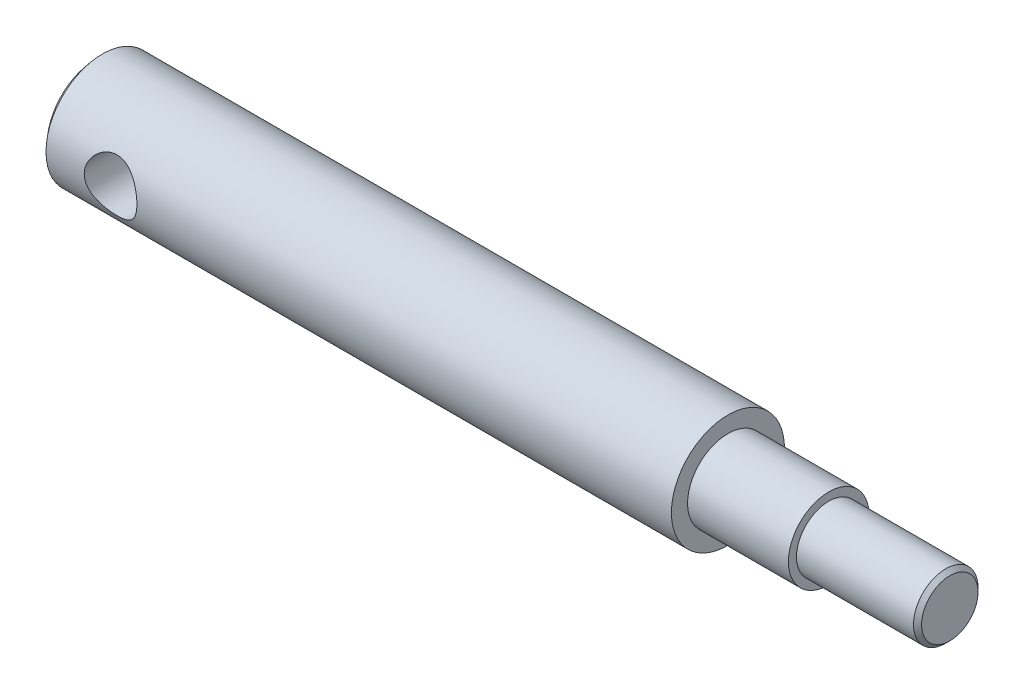
ISO-10303-21;
HEADER;
FILE_DESCRIPTION(('STEP AP214'),'2;1');
FILE_NAME('part.step','',(''),(''),'','','');
FILE_SCHEMA(('AUTOMOTIVE_DESIGN { 1 0 10303 214 1 1 1 1 }'));
ENDSEC;
DATA;
#1=APPLICATION_CONTEXT('core data for automotive mechanical design processes');
#2=APPLICATION_PROTOCOL_DEFINITION('international standard','automotive_design',2000,#1);
#3=PRODUCT_CONTEXT('',#1,'mechanical');
#4=PRODUCT('Part','Part','',(#3));
#5=PRODUCT_RELATED_PRODUCT_CATEGORY('part','',(#4));
#6=PRODUCT_DEFINITION_FORMATION('','',#4);
#7=PRODUCT_DEFINITION_CONTEXT('part definition',#1,'design');
#8=PRODUCT_DEFINITION('design','',#6,#7);
#9=PRODUCT_DEFINITION_SHAPE('','',#8);
#10=(LENGTH_UNIT() NAMED_UNIT(*) SI_UNIT(.MILLI.,.METRE.));
#11=(NAMED_UNIT(*) PLANE_ANGLE_UNIT() SI_UNIT($,.RADIAN.));
#12=(NAMED_UNIT(*) SI_UNIT($,.STERADIAN.) SOLID_ANGLE_UNIT());
#13=UNCERTAINTY_MEASURE_WITH_UNIT(LENGTH_MEASURE(1.E-05),#10,'distance_accuracy_value','');
#14=(GEOMETRIC_REPRESENTATION_CONTEXT(3) GLOBAL_UNCERTAINTY_ASSIGNED_CONTEXT((#13)) GLOBAL_UNIT_ASSIGNED_CONTEXT((#10,
#11,#12)) REPRESENTATION_CONTEXT('',''));
#15=CARTESIAN_POINT('',(0.,0.,0.));
#16=DIRECTION('',(0.,0.,1.));
#17=DIRECTION('',(1.,0.,0.));
#18=AXIS2_PLACEMENT_3D('',#15,#16,#17);
#19=CARTESIAN_POINT('',(21.9709396637103,0.,-1.13040271301872));
#20=DIRECTION('',(0.,-1.,0.));
#21=DIRECTION('',(0.,0.,1.));
#22=AXIS2_PLACEMENT_3D('',#19,#20,#21);
#23=CIRCLE('',#22,22.);
#24=TRIMMED_CURVE('',#23,(PARAMETER_VALUE(-1.51939174944715)),
(PARAMETER_VALUE(1.51939174944715)),.T.,.PARAMETER.);
#25=CARTESIAN_POINT('',(21.9709396637103,0.,0.));
#26=DIRECTION('',(-1.,0.,0.));
#27=AXIS1_PLACEMENT('',#25,#26);
#28=SURFACE_OF_REVOLUTION('',#24,#27);
#29=CARTESIAN_POINT('',(0.,0.,0.));
#30=VERTEX_POINT('',#29);
#31=VERTEX_LOOP('',#30);
#32=FACE_BOUND('',#31,.T.);
#33=CARTESIAN_POINT('',(6.,0.,0.));
#34=DIRECTION('',(-1.,0.,0.));
#35=DIRECTION('',(0.,0.,1.));
#36=AXIS2_PLACEMENT_3D('',#33,#34,#35);
#37=CIRCLE('',#36,14.);
#38=CARTESIAN_POINT('',(6.,0.,14.));
#39=VERTEX_POINT('',#38);
#40=EDGE_CURVE('E65',#39,#39,#37,.T.);
#41=ORIENTED_EDGE('',*,*,#40,.T.);
#42=EDGE_LOOP('',(#41));
#43=FACE_BOUND('',#42,.T.);
#44=ADVANCED_FACE('F43',(#32,#43),#28,.T.);
#45=CARTESIAN_POINT('',(216.,0.,0.));
#46=DIRECTION('',(-1.,0.,0.));
#47=DIRECTION('',(0.,0.,1.));
#48=AXIS2_PLACEMENT_3D('',#45,#46,#47);
#49=PLANE('',#48);
#50=CARTESIAN_POINT('',(216.,0.,0.));
#51=DIRECTION('',(-1.,0.,0.));
#52=DIRECTION('',(0.,0.,1.));
#53=AXIS2_PLACEMENT_3D('',#50,#51,#52);
#54=CIRCLE('',#53,6.99999999999996);
#55=CARTESIAN_POINT('',(216.,0.,6.99999999999996));
#56=VERTEX_POINT('',#55);
#57=EDGE_CURVE('E11',#56,#56,#54,.T.);
#58=ORIENTED_EDGE('',*,*,#57,.F.);
#59=EDGE_LOOP('',(#58));
#60=FACE_BOUND('',#59,.T.);
#61=ADVANCED_FACE('F62',(#60),#49,.F.);
#62=CARTESIAN_POINT('',(216.,0.,0.));
#63=DIRECTION('',(-1.,0.,0.));
#64=DIRECTION('',(0.,0.,1.));
#65=AXIS2_PLACEMENT_3D('',#62,#63,#64);
#66=CONICAL_SURFACE('',#65,6.99999999999996,0.785398163397448);
#67=CARTESIAN_POINT('',(215.,0.,0.));
#68=DIRECTION('',(-1.,0.,0.));
#69=DIRECTION('',(0.,0.,1.));
#70=AXIS2_PLACEMENT_3D('',#67,#68,#69);
#71=CIRCLE('',#70,7.99999999999996);
#72=CARTESIAN_POINT('',(215.,0.,7.99999999999996));
#73=VERTEX_POINT('',#72);
#74=EDGE_CURVE('E56',#73,#73,#71,.T.);
#75=ORIENTED_EDGE('',*,*,#74,.F.);
#76=EDGE_LOOP('',(#75));
#77=FACE_BOUND('',#76,.T.);
#78=ORIENTED_EDGE('',*,*,#57,.T.);
#79=EDGE_LOOP('',(#78));
#80=FACE_BOUND('',#79,.T.);
#81=ADVANCED_FACE('F135',(#77,#80),#66,.T.);
#82=CARTESIAN_POINT('',(0.,0.,0.));
#83=DIRECTION('',(-1.,0.,0.));
#84=DIRECTION('',(0.,0.,1.));
#85=AXIS2_PLACEMENT_3D('',#82,#83,#84);
#86=CYLINDRICAL_SURFACE('',#85,7.99999999999996);
#87=CARTESIAN_POINT('',(186.,0.,0.));
#88=DIRECTION('',(-1.,0.,0.));
#89=DIRECTION('',(0.,0.,1.));
#90=AXIS2_PLACEMENT_3D('',#87,#88,#89);
#91=CIRCLE('',#90,7.99999999999997);
#92=CARTESIAN_POINT('',(186.,0.,7.99999999999997));
#93=VERTEX_POINT('',#92);
#94=EDGE_CURVE('E85',#93,#93,#91,.T.);
#95=ORIENTED_EDGE('',*,*,#94,.F.);
#96=EDGE_LOOP('',(#95));
#97=FACE_BOUND('',#96,.T.);
#98=ORIENTED_EDGE('',*,*,#74,.T.);
#99=EDGE_LOOP('',(#98));
#100=FACE_BOUND('',#99,.T.);
#101=ADVANCED_FACE('F129',(#97,#100),#86,.T.);
#102=CARTESIAN_POINT('',(186.,7.99999999999997,0.));
#103=DIRECTION('',(-1.,0.,0.));
#104=DIRECTION('',(0.,0.,1.));
#105=AXIS2_PLACEMENT_3D('',#102,#103,#104);
#106=PLANE('',#105);
#107=CARTESIAN_POINT('',(186.,0.,0.));
#108=DIRECTION('',(-1.,0.,0.));
#109=DIRECTION('',(0.,0.,1.));
#110=AXIS2_PLACEMENT_3D('',#107,#108,#109);
#111=CIRCLE('',#110,10.);
#112=CARTESIAN_POINT('',(186.,0.,10.));
#113=VERTEX_POINT('',#112);
#114=EDGE_CURVE('E81',#113,#113,#111,.T.);
#115=ORIENTED_EDGE('',*,*,#114,.F.);
#116=EDGE_LOOP('',(#115));
#117=FACE_BOUND('',#116,.T.);
#118=ORIENTED_EDGE('',*,*,#94,.T.);
#119=EDGE_LOOP('',(#118));
#120=FACE_BOUND('',#119,.T.);
#121=ADVANCED_FACE('F123',(#117,#120),#106,.F.);
#122=CARTESIAN_POINT('',(0.,0.,0.));
#123=DIRECTION('',(-1.,0.,0.));
#124=DIRECTION('',(0.,0.,1.));
#125=AXIS2_PLACEMENT_3D('',#122,#123,#124);
#126=CYLINDRICAL_SURFACE('',#125,9.99999999999999);
#127=CARTESIAN_POINT('',(161.,0.,0.));
#128=DIRECTION('',(-1.,0.,0.));
#129=DIRECTION('',(0.,0.,1.));
#130=AXIS2_PLACEMENT_3D('',#127,#128,#129);
#131=CIRCLE('',#130,9.99999999999999);
#132=CARTESIAN_POINT('',(161.,0.,9.99999999999999));
#133=VERTEX_POINT('',#132);
#134=EDGE_CURVE('E73',#133,#133,#131,.T.);
#135=ORIENTED_EDGE('',*,*,#134,.F.);
#136=EDGE_LOOP('',(#135));
#137=FACE_BOUND('',#136,.T.);
#138=ORIENTED_EDGE('',*,*,#114,.T.);
#139=EDGE_LOOP('',(#138));
#140=FACE_BOUND('',#139,.T.);
#141=ADVANCED_FACE('F118',(#137,#140),#126,.T.);
#142=CARTESIAN_POINT('',(161.,9.99999999999999,0.));
#143=DIRECTION('',(-1.,0.,0.));
#144=DIRECTION('',(0.,0.,1.));
#145=AXIS2_PLACEMENT_3D('',#142,#143,#144);
#146=PLANE('',#145);
#147=CARTESIAN_POINT('',(161.,0.,0.));
#148=DIRECTION('',(-1.,0.,0.));
#149=DIRECTION('',(0.,0.,1.));
#150=AXIS2_PLACEMENT_3D('',#147,#148,#149);
#151=CIRCLE('',#150,14.);
#152=CARTESIAN_POINT('',(161.,0.,14.));
#153=VERTEX_POINT('',#152);
#154=EDGE_CURVE('E68',#153,#153,#151,.T.);
#155=ORIENTED_EDGE('',*,*,#154,.F.);
#156=EDGE_LOOP('',(#155));
#157=FACE_BOUND('',#156,.T.);
#158=ORIENTED_EDGE('',*,*,#134,.T.);
#159=EDGE_LOOP('',(#158));
#160=FACE_BOUND('',#159,.T.);
#161=ADVANCED_FACE('F107',(#157,#160),#146,.F.);
#162=CARTESIAN_POINT('',(0.,0.,0.));
#163=DIRECTION('',(-1.,0.,0.));
#164=DIRECTION('',(0.,0.,1.));
#165=AXIS2_PLACEMENT_3D('',#162,#163,#164);
#166=CYLINDRICAL_SURFACE('',#165,14.);
#167=CARTESIAN_POINT('',(28.525,0.,14.));
#168=CARTESIAN_POINT('',(28.5249988115517,-0.172961585399824,13.9999989763916));
#169=CARTESIAN_POINT('',(28.5181142009919,-0.345955335434678,13.9967866267679));
#170=CARTESIAN_POINT('',(28.4906472082468,-0.690686654918813,13.9840170322901));
#171=CARTESIAN_POINT('',(28.4700576977243,-0.86242352360486,13.9744564855512));
#172=CARTESIAN_POINT('',(28.4153656284769,-1.20357884662734,13.9492186729422));
#173=CARTESIAN_POINT('',(28.3812399649993,-1.37299282183549,13.9335309493484));
#174=CARTESIAN_POINT('',(28.2998340414739,-1.70805603372384,13.8964373934108));
#175=CARTESIAN_POINT('',(28.2525484040739,-1.8737037014445,13.8750292237546));
#176=CARTESIAN_POINT('',(28.1455325345178,-2.19938966095088,13.8271351485202));
#177=CARTESIAN_POINT('',(28.0858547228063,-2.35944836591319,13.8006706682818));
#178=CARTESIAN_POINT('',(27.9544618529155,-2.67376897138034,13.7432347055915));
#179=CARTESIAN_POINT('',(27.8827422987142,-2.8280286802885,13.7122615403098));
#180=CARTESIAN_POINT('',(27.7279092536524,-3.12976206362347,13.6465529347583));
#181=CARTESIAN_POINT('',(27.6448027589596,-3.27723983115224,13.6118198073492));
#182=CARTESIAN_POINT('',(27.4677595136981,-3.5647963977443,13.5393595459155));
#183=CARTESIAN_POINT('',(27.3738188114603,-3.70487246977678,13.5016313210325));
#184=CARTESIAN_POINT('',(27.0658905241392,-4.12772725323102,13.3809785077786));
#185=CARTESIAN_POINT('',(26.8341505463098,-4.39678369077359,13.2942642643216));
#186=CARTESIAN_POINT('',(26.3303201868583,-4.89380166725161,13.1194636813799));
#187=CARTESIAN_POINT('',(26.0582035223154,-5.12173622241705,13.0313764818575));
#188=CARTESIAN_POINT('',(25.6146104957753,-5.43561918418219,12.9022479894684));
#189=CARTESIAN_POINT('',(25.4554620225076,-5.53817375744852,12.8584428072728));
#190=CARTESIAN_POINT('',(25.1281745789026,-5.72940047695437,12.7743832344047));
#191=CARTESIAN_POINT('',(24.9600393698687,-5.81807837103057,12.7341273766049));
#192=CARTESIAN_POINT('',(24.6157626284436,-5.98077462726117,12.6585303796142));
#193=CARTESIAN_POINT('',(24.4396213238958,-6.05479340627467,12.6231891006767));
#194=CARTESIAN_POINT('',(24.0805936424508,-6.18735332878388,12.558745759908));
#195=CARTESIAN_POINT('',(23.8977110859509,-6.245903089752,12.5296402259874));
#196=CARTESIAN_POINT('',(23.5368302827655,-6.34403492447861,12.4802272326423));
#197=CARTESIAN_POINT('',(23.3591238661684,-6.38448902139486,12.4595212822461));
#198=CARTESIAN_POINT('',(23.0002550028712,-6.45045668760313,12.4254976779733));
#199=CARTESIAN_POINT('',(22.8190926864607,-6.47597081899671,12.4121797461307));
#200=CARTESIAN_POINT('',(22.4549764606993,-6.51168669968098,12.3934799341597));
#201=CARTESIAN_POINT('',(22.2720238246464,-6.52189863375826,12.388092775535));
#202=CARTESIAN_POINT('',(21.9058560399226,-6.52688900167993,12.3854645237546));
#203=CARTESIAN_POINT('',(21.7226409119551,-6.52166859223294,12.3882228200683));
#204=CARTESIAN_POINT('',(21.3760237847957,-6.49718053639865,12.4010807663484));
#205=CARTESIAN_POINT('',(21.2124867145946,-6.47938234327563,12.4104121469332));
#206=CARTESIAN_POINT('',(20.8876268593489,-6.43157933933406,12.4352528359294));
#207=CARTESIAN_POINT('',(20.7263048358651,-6.40157043383265,12.4507642166765));
#208=CARTESIAN_POINT('',(20.4070281826959,-6.32967932482516,12.4874650625722));
#209=CARTESIAN_POINT('',(20.249072938609,-6.28779930796616,12.5086534819766));
#210=CARTESIAN_POINT('',(19.9373822864394,-6.19256031253002,12.5560751969003));
#211=CARTESIAN_POINT('',(19.7836485493526,-6.13919686027294,12.5823104581283));
#212=CARTESIAN_POINT('',(19.4778565907212,-6.02012794604627,12.6397200367822));
#213=CARTESIAN_POINT('',(19.3259148480781,-5.95417070558451,12.6709926166382));
#214=CARTESIAN_POINT('',(19.0280908928989,-5.81125528934606,12.7371704644988));
#215=CARTESIAN_POINT('',(18.8822108893314,-5.73429314784986,12.7720770408097));
#216=CARTESIAN_POINT('',(18.4547119198259,-5.48768922342668,12.8808992105527));
#217=CARTESIAN_POINT('',(18.183079041386,-5.30226913436632,12.9589478321659));
#218=CARTESIAN_POINT('',(17.6435687383132,-4.87122899435166,13.1274558652518));
#219=CARTESIAN_POINT('',(17.3792818546795,-4.62126474054235,13.2183440942223));
#220=CARTESIAN_POINT('',(17.0162561033881,-4.21556240904635,13.3510078610789));
#221=CARTESIAN_POINT('',(16.9007457212029,-4.07509303387124,13.3946469871098));
#222=CARTESIAN_POINT('',(16.6815667853414,-3.78456900183375,13.4796104485132));
#223=CARTESIAN_POINT('',(16.5778937527845,-3.63451800408817,13.5209356563632));
#224=CARTESIAN_POINT('',(16.3796197240387,-3.32005136498874,13.6016379344314));
#225=CARTESIAN_POINT('',(16.2854797901025,-3.15531303915949,13.6408912818627));
#226=CARTESIAN_POINT('',(16.1115764943754,-2.8174750155879,13.7146529983504));
#227=CARTESIAN_POINT('',(16.031807154623,-2.64437883276825,13.7491633390066));
#228=CARTESIAN_POINT('',(15.8874476453614,-2.29101329254453,13.8124386579041));
#229=CARTESIAN_POINT('',(15.8228524449784,-2.11074633580135,13.8412055398706));
#230=CARTESIAN_POINT('',(15.7095682957501,-1.74437589518115,13.8921323873824));
#231=CARTESIAN_POINT('',(15.660877787126,-1.55827298560125,13.9142930007883));
#232=CARTESIAN_POINT('',(15.5830642534276,-1.19594077902035,13.9499225229576));
#233=CARTESIAN_POINT('',(15.5527465542942,-1.02001925822351,13.9639190924338));
#234=CARTESIAN_POINT('',(15.5066117107657,-0.665890433565697,13.9852796172365));
#235=CARTESIAN_POINT('',(15.490793503867,-0.487683298162096,13.992644058556));
#236=CARTESIAN_POINT('',(15.4738554552896,-0.130477882043718,14.0005314804953));
#237=CARTESIAN_POINT('',(15.4727309478196,0.0485201294777032,14.0010566328414));
#238=CARTESIAN_POINT('',(15.4851828551948,0.405888971009847,13.9952558452273));
#239=CARTESIAN_POINT('',(15.4987587737087,0.584259821991445,13.988930136573));
#240=CARTESIAN_POINT('',(15.539070984327,0.927288621582246,13.9702428704933));
#241=CARTESIAN_POINT('',(15.5648862570086,1.09207901115573,13.9583041542548));
#242=CARTESIAN_POINT('',(15.6289395296202,1.41877781854867,13.9288900033359));
#243=CARTESIAN_POINT('',(15.667181512164,1.58068529485822,13.9114127936784));
#244=CARTESIAN_POINT('',(15.7556943002216,1.90047071621246,13.8713436001078));
#245=CARTESIAN_POINT('',(15.8059615391909,2.05834984068173,13.8487531328315));
#246=CARTESIAN_POINT('',(15.9180905730616,2.3692458347878,13.7989664212972));
#247=CARTESIAN_POINT('',(15.9799567995973,2.52226081975797,13.7717684170182));
#248=CARTESIAN_POINT('',(16.1168084470812,2.82708742867824,13.7124906076469));
#249=CARTESIAN_POINT('',(16.1921341771189,2.97872256024072,13.6802879935455));
#250=CARTESIAN_POINT('',(16.3539563562946,3.27511289944075,13.6123766267351));
#251=CARTESIAN_POINT('',(16.4404569004608,3.41986555825092,13.5766665898813));
#252=CARTESIAN_POINT('',(16.7158502844001,3.84270665563548,13.4654497118022));
#253=CARTESIAN_POINT('',(16.9207084430537,4.10954097919032,13.3858231514148));
#254=CARTESIAN_POINT('',(17.3876381841635,4.62975268144804,13.2154043406347));
#255=CARTESIAN_POINT('',(17.6531501049967,4.87990226815509,13.1242450729771));
#256=CARTESIAN_POINT('',(18.2234280171084,5.33344766120907,12.9465716243688));
#257=CARTESIAN_POINT('',(18.5282125059958,5.53682130929724,12.8600596597061));
#258=CARTESIAN_POINT('',(19.0148182921882,5.80519094930559,12.7400866812116));
#259=CARTESIAN_POINT('',(19.1848810653573,5.8895626271787,12.7011926943675));
#260=CARTESIAN_POINT('',(19.5326369236379,6.04349581775784,12.6286733960662));
#261=CARTESIAN_POINT('',(19.7103265477264,6.11306396459724,12.5950457263251));
#262=CARTESIAN_POINT('',(20.072003611947,6.23658222951957,12.5343442158876));
#263=CARTESIAN_POINT('',(20.255986688443,6.29054293321921,12.5072659351743));
#264=CARTESIAN_POINT('',(20.6289039252938,6.38220710441621,12.4607417244458));
#265=CARTESIAN_POINT('',(20.8178374439198,6.41991266812527,12.4412948103426));
#266=CARTESIAN_POINT('',(21.1817975844801,6.47587500323595,12.4122496079689));
#267=CARTESIAN_POINT('',(21.3565449320331,6.49557708687484,12.4019222949215));
#268=CARTESIAN_POINT('',(21.7073353609104,6.52080412662806,12.3886771358058));
#269=CARTESIAN_POINT('',(21.8833783401378,6.52633018807912,12.3857587120496));
#270=CARTESIAN_POINT('',(22.2352546483854,6.5231305752807,12.3874440236919));
#271=CARTESIAN_POINT('',(22.4110880167595,6.51440822838444,12.3920460028917));
#272=CARTESIAN_POINT('',(22.7611277111579,6.48283802946988,12.4085908784933));
#273=CARTESIAN_POINT('',(22.9353340755161,6.45999051111194,12.4205336014943));
#274=CARTESIAN_POINT('',(23.2681439100937,6.40264322892485,12.4501853406126));
#275=CARTESIAN_POINT('',(23.4269593462454,6.36911384671563,12.467410770028));
#276=CARTESIAN_POINT('',(23.7410633757841,6.29051221557066,12.5072537515944));
#277=CARTESIAN_POINT('',(23.8963508388004,6.24543632234308,12.52987300598));
#278=CARTESIAN_POINT('',(24.202452012443,6.14416880409382,12.5798399519487));
#279=CARTESIAN_POINT('',(24.3532662948025,6.08797860673291,12.6071870361731));
#280=CARTESIAN_POINT('',(24.6497026242441,5.96493813634605,12.6658657668393));
#281=CARTESIAN_POINT('',(24.7953227402962,5.89808394829493,12.6971988757946));
#282=CARTESIAN_POINT('',(25.2421227488125,5.67275442544941,12.8003252418963));
#283=CARTESIAN_POINT('',(25.5330682312975,5.49613888531192,12.8778161655023));
#284=CARTESIAN_POINT('',(26.0829370858879,5.10098162511738,13.0393796079082));
#285=CARTESIAN_POINT('',(26.3418454529104,4.88242038046839,13.1234551808546));
#286=CARTESIAN_POINT('',(26.7146680208038,4.51465719729696,13.2528145150157));
#287=CARTESIAN_POINT('',(26.8414509308316,4.3784294323978,13.298550359562));
#288=CARTESIAN_POINT('',(27.0831370874232,4.0953567747769,13.388430498827));
#289=CARTESIAN_POINT('',(27.1980443531618,3.94851550285482,13.4325753286903));
#290=CARTESIAN_POINT('',(27.4153066692637,3.64485529779218,13.518133751299));
#291=CARTESIAN_POINT('',(27.5176497591398,3.48802706991158,13.5595447244783));
#292=CARTESIAN_POINT('',(27.7088063697523,3.16548198919471,13.6384481649685));
#293=CARTESIAN_POINT('',(27.7976261393903,2.99976928988266,13.675942439591));
#294=CARTESIAN_POINT('',(27.9605671899454,2.66127217939511,13.745811885276));
#295=CARTESIAN_POINT('',(28.0347592102392,2.48852693331199,13.7782115315379));
#296=CARTESIAN_POINT('',(28.1681860308318,2.13647333246546,13.837171365666));
#297=CARTESIAN_POINT('',(28.2274281017542,1.95716821673893,13.863734391246));
#298=CARTESIAN_POINT('',(28.3301864336825,1.59372144054665,13.910195521747));
#299=CARTESIAN_POINT('',(28.3737391340218,1.40959206665999,13.9301090624528));
#300=CARTESIAN_POINT('',(28.4447310404681,1.03771715503999,13.9627337045398));
#301=CARTESIAN_POINT('',(28.4721809319526,0.849974100876478,13.9754495818939));
#302=CARTESIAN_POINT('',(28.5025884878905,0.551502206533356,13.9895655974164));
#303=CARTESIAN_POINT('',(28.510988318285,0.441414367152074,13.9934741984445));
#304=CARTESIAN_POINT('',(28.5221945089965,0.220888728589875,13.9986917522194));
#305=CARTESIAN_POINT('',(28.525000758927,0.110450922545613,14.0000006536624));
#306=CARTESIAN_POINT('',(28.525,0.,14.));
#307=B_SPLINE_CURVE_WITH_KNOTS('',3,(#167,#168,#169,#170,#171,#172,#173,#174,#175,#176,#177,
#178,#179,#180,#181,#182,#183,#184,#185,#186,#187,#188,#189,#190,#191,#192,#193,#194,#195,#196,
#197,#198,#199,#200,#201,#202,#203,#204,#205,#206,#207,#208,#209,#210,#211,#212,#213,#214,#215,
#216,#217,#218,#219,#220,#221,#222,#223,#224,#225,#226,#227,#228,#229,#230,#231,#232,#233,#234,
#235,#236,#237,#238,#239,#240,#241,#242,#243,#244,#245,#246,#247,#248,#249,#250,#251,#252,#253,
#254,#255,#256,#257,#258,#259,#260,#261,#262,#263,#264,#265,#266,#267,#268,#269,#270,#271,#272,
#273,#274,#275,#276,#277,#278,#279,#280,#281,#282,#283,#284,#285,#286,#287,#288,#289,#290,#291,
#292,#293,#294,#295,#296,#297,#298,#299,#300,#301,#302,#303,#304,#305,#306),.UNSPECIFIED.,.T.,
.F.,(4,2,2,2,2,2,2,2,2,2,2,2,2,2,2,2,2,2,2,2,2,2,2,2,2,2,2,2,2,2,2,2,2,2,2,2,2,2,2,2,2,2,2,2,2,
2,2,2,2,2,2,2,2,2,2,2,2,2,2,2,2,2,2,2,2,2,2,2,2,4),(0.,0.518774771874318,1.03781958542481,
1.5577541914376,2.07790156282594,2.59589190290914,3.11407607673987,3.63194329262075,
4.14999999635844,5.24166307129228,6.33403989966914,6.91641013486513,7.49853850525524,
8.08065031936876,8.66243716389736,9.21195049476588,9.7614431494058,10.3105699118167,
10.8596555162821,11.3533769616188,11.847264105805,12.3410603355145,12.8350492861673,
13.3402076103385,13.8455484339837,14.8557277305862,15.9752751148162,16.53583521864,
17.0961825163367,17.676705999723,18.2569874332041,18.8370762062759,19.4171080727391,
19.9535903845765,20.4900333805529,21.0263060319568,21.562560577717,22.0636627803876,
22.5649257390508,23.0660402131396,23.5673465400505,24.0838208546064,24.6004849717053,
25.6332742036849,26.7565587750209,27.8803743672462,28.4610799247574,29.0415246911394,
29.6215748476069,30.20155018024,30.7293123413865,31.2570333504645,31.7846311413446,
32.3122164699522,32.8013580175244,33.2906541378189,33.7798874475458,34.2693007825445,
35.3119615810932,36.3551088923694,36.9294367609828,37.5035696140134,38.0782448440269,
38.6526537149474,39.2242126872133,39.7954931546093,40.3654381079993,40.9350044326507,
41.2662804282834,41.5975629614219),.UNSPECIFIED.);
#308=CARTESIAN_POINT('',(28.525,0.,14.));
#309=VERTEX_POINT('',#308);
#310=EDGE_CURVE('E46',#309,#309,#307,.T.);
#311=ORIENTED_EDGE('',*,*,#310,.T.);
#312=EDGE_LOOP('',(#311));
#313=FACE_BOUND('',#312,.T.);
#314=CARTESIAN_POINT('',(28.525,0.,-14.));
#315=CARTESIAN_POINT('',(28.5249988115517,0.172961585399824,-13.9999989763916));
#316=CARTESIAN_POINT('',(28.5181142009919,0.345955335434678,-13.9967866267679));
#317=CARTESIAN_POINT('',(28.4906472082468,0.690686654918813,-13.9840170322901));
#318=CARTESIAN_POINT('',(28.4700576977243,0.86242352360486,-13.9744564855512));
#319=CARTESIAN_POINT('',(28.4153656284769,1.20357884662734,-13.9492186729422));
#320=CARTESIAN_POINT('',(28.3812399649993,1.37299282183549,-13.9335309493484));
#321=CARTESIAN_POINT('',(28.2998340414739,1.70805603372384,-13.8964373934108));
#322=CARTESIAN_POINT('',(28.2525484040739,1.8737037014445,-13.8750292237546));
#323=CARTESIAN_POINT('',(28.1455325345178,2.19938966095088,-13.8271351485202));
#324=CARTESIAN_POINT('',(28.0858547228063,2.35944836591319,-13.8006706682818));
#325=CARTESIAN_POINT('',(27.9544618529155,2.67376897138034,-13.7432347055915));
#326=CARTESIAN_POINT('',(27.8827422987142,2.8280286802885,-13.7122615403098));
#327=CARTESIAN_POINT('',(27.7279092536524,3.12976206362347,-13.6465529347583));
#328=CARTESIAN_POINT('',(27.6448027589596,3.27723983115224,-13.6118198073492));
#329=CARTESIAN_POINT('',(27.4677595136981,3.5647963977443,-13.5393595459155));
#330=CARTESIAN_POINT('',(27.3738188114603,3.70487246977678,-13.5016313210325));
#331=CARTESIAN_POINT('',(27.0658905241392,4.12772725323102,-13.3809785077786));
#332=CARTESIAN_POINT('',(26.8341505463098,4.39678369077359,-13.2942642643216));
#333=CARTESIAN_POINT('',(26.3303201868583,4.89380166725161,-13.1194636813799));
#334=CARTESIAN_POINT('',(26.0582035223154,5.12173622241705,-13.0313764818575));
#335=CARTESIAN_POINT('',(25.6146104957753,5.43561918418219,-12.9022479894684));
#336=CARTESIAN_POINT('',(25.4554620225076,5.53817375744852,-12.8584428072728));
#337=CARTESIAN_POINT('',(25.1281745789026,5.72940047695437,-12.7743832344047));
#338=CARTESIAN_POINT('',(24.9600393698687,5.81807837103057,-12.7341273766049));
#339=CARTESIAN_POINT('',(24.6157626284436,5.98077462726117,-12.6585303796142));
#340=CARTESIAN_POINT('',(24.4396213238958,6.05479340627467,-12.6231891006767));
#341=CARTESIAN_POINT('',(24.0805936424508,6.18735332878388,-12.558745759908));
#342=CARTESIAN_POINT('',(23.8977110859509,6.245903089752,-12.5296402259874));
#343=CARTESIAN_POINT('',(23.5368302827655,6.34403492447861,-12.4802272326423));
#344=CARTESIAN_POINT('',(23.3591238661684,6.38448902139486,-12.4595212822461));
#345=CARTESIAN_POINT('',(23.0002550028712,6.45045668760313,-12.4254976779733));
#346=CARTESIAN_POINT('',(22.8190926864607,6.47597081899671,-12.4121797461307));
#347=CARTESIAN_POINT('',(22.4549764606993,6.51168669968098,-12.3934799341597));
#348=CARTESIAN_POINT('',(22.2720238246464,6.52189863375826,-12.388092775535));
#349=CARTESIAN_POINT('',(21.9058560399226,6.52688900167993,-12.3854645237546));
#350=CARTESIAN_POINT('',(21.7226409119551,6.52166859223294,-12.3882228200683));
#351=CARTESIAN_POINT('',(21.3760237847957,6.49718053639865,-12.4010807663484));
#352=CARTESIAN_POINT('',(21.2124867145946,6.47938234327563,-12.4104121469332));
#353=CARTESIAN_POINT('',(20.8876268593489,6.43157933933406,-12.4352528359294));
#354=CARTESIAN_POINT('',(20.7263048358651,6.40157043383265,-12.4507642166765));
#355=CARTESIAN_POINT('',(20.4070281826959,6.32967932482516,-12.4874650625722));
#356=CARTESIAN_POINT('',(20.249072938609,6.28779930796616,-12.5086534819766));
#357=CARTESIAN_POINT('',(19.9373822864394,6.19256031253002,-12.5560751969003));
#358=CARTESIAN_POINT('',(19.7836485493526,6.13919686027294,-12.5823104581283));
#359=CARTESIAN_POINT('',(19.4778565907212,6.02012794604627,-12.6397200367822));
#360=CARTESIAN_POINT('',(19.3259148480781,5.95417070558451,-12.6709926166382));
#361=CARTESIAN_POINT('',(19.0280908928989,5.81125528934606,-12.7371704644988));
#362=CARTESIAN_POINT('',(18.8822108893314,5.73429314784986,-12.7720770408097));
#363=CARTESIAN_POINT('',(18.4547119198259,5.48768922342668,-12.8808992105527));
#364=CARTESIAN_POINT('',(18.183079041386,5.30226913436632,-12.9589478321659));
#365=CARTESIAN_POINT('',(17.6435687383132,4.87122899435166,-13.1274558652518));
#366=CARTESIAN_POINT('',(17.3792818546795,4.62126474054235,-13.2183440942223));
#367=CARTESIAN_POINT('',(17.0162561033881,4.21556240904635,-13.3510078610789));
#368=CARTESIAN_POINT('',(16.9007457212029,4.07509303387124,-13.3946469871098));
#369=CARTESIAN_POINT('',(16.6815667853414,3.78456900183375,-13.4796104485132));
#370=CARTESIAN_POINT('',(16.5778937527845,3.63451800408817,-13.5209356563632));
#371=CARTESIAN_POINT('',(16.3796197240387,3.32005136498874,-13.6016379344314));
#372=CARTESIAN_POINT('',(16.2854797901025,3.15531303915949,-13.6408912818627));
#373=CARTESIAN_POINT('',(16.1115764943754,2.8174750155879,-13.7146529983504));
#374=CARTESIAN_POINT('',(16.031807154623,2.64437883276825,-13.7491633390066));
#375=CARTESIAN_POINT('',(15.8874476453614,2.29101329254453,-13.8124386579041));
#376=CARTESIAN_POINT('',(15.8228524449784,2.11074633580135,-13.8412055398706));
#377=CARTESIAN_POINT('',(15.7095682957501,1.74437589518115,-13.8921323873824));
#378=CARTESIAN_POINT('',(15.660877787126,1.55827298560125,-13.9142930007883));
#379=CARTESIAN_POINT('',(15.5830642534276,1.19594077902035,-13.9499225229576));
#380=CARTESIAN_POINT('',(15.5527465542942,1.02001925822351,-13.9639190924338));
#381=CARTESIAN_POINT('',(15.5066117107657,0.665890433565697,-13.9852796172365));
#382=CARTESIAN_POINT('',(15.490793503867,0.487683298162096,-13.992644058556));
#383=CARTESIAN_POINT('',(15.4738554552896,0.130477882043718,-14.0005314804953));
#384=CARTESIAN_POINT('',(15.4727309478196,-0.0485201294777032,-14.0010566328414));
#385=CARTESIAN_POINT('',(15.4851828551948,-0.405888971009847,-13.9952558452273));
#386=CARTESIAN_POINT('',(15.4987587737087,-0.584259821991445,-13.988930136573));
#387=CARTESIAN_POINT('',(15.539070984327,-0.927288621582246,-13.9702428704933));
#388=CARTESIAN_POINT('',(15.5648862570086,-1.09207901115573,-13.9583041542548));
#389=CARTESIAN_POINT('',(15.6289395296202,-1.41877781854867,-13.9288900033359));
#390=CARTESIAN_POINT('',(15.667181512164,-1.58068529485822,-13.9114127936784));
#391=CARTESIAN_POINT('',(15.7556943002216,-1.90047071621246,-13.8713436001078));
#392=CARTESIAN_POINT('',(15.8059615391909,-2.05834984068173,-13.8487531328315));
#393=CARTESIAN_POINT('',(15.9180905730616,-2.3692458347878,-13.7989664212972));
#394=CARTESIAN_POINT('',(15.9799567995973,-2.52226081975797,-13.7717684170182));
#395=CARTESIAN_POINT('',(16.1168084470812,-2.82708742867824,-13.7124906076469));
#396=CARTESIAN_POINT('',(16.1921341771189,-2.97872256024072,-13.6802879935455));
#397=CARTESIAN_POINT('',(16.3539563562946,-3.27511289944075,-13.6123766267351));
#398=CARTESIAN_POINT('',(16.4404569004608,-3.41986555825092,-13.5766665898813));
#399=CARTESIAN_POINT('',(16.7158502844001,-3.84270665563548,-13.4654497118022));
#400=CARTESIAN_POINT('',(16.9207084430537,-4.10954097919032,-13.3858231514148));
#401=CARTESIAN_POINT('',(17.3876381841635,-4.62975268144804,-13.2154043406347));
#402=CARTESIAN_POINT('',(17.6531501049967,-4.87990226815509,-13.1242450729771));
#403=CARTESIAN_POINT('',(18.2234280171084,-5.33344766120907,-12.9465716243688));
#404=CARTESIAN_POINT('',(18.5282125059958,-5.53682130929724,-12.8600596597061));
#405=CARTESIAN_POINT('',(19.0148182921882,-5.80519094930559,-12.7400866812116));
#406=CARTESIAN_POINT('',(19.1848810653573,-5.8895626271787,-12.7011926943675));
#407=CARTESIAN_POINT('',(19.5326369236379,-6.04349581775784,-12.6286733960662));
#408=CARTESIAN_POINT('',(19.7103265477264,-6.11306396459724,-12.5950457263251));
#409=CARTESIAN_POINT('',(20.072003611947,-6.23658222951957,-12.5343442158876));
#410=CARTESIAN_POINT('',(20.255986688443,-6.29054293321921,-12.5072659351743));
#411=CARTESIAN_POINT('',(20.6289039252938,-6.38220710441621,-12.4607417244458));
#412=CARTESIAN_POINT('',(20.8178374439198,-6.41991266812527,-12.4412948103426));
#413=CARTESIAN_POINT('',(21.1817975844801,-6.47587500323595,-12.4122496079689));
#414=CARTESIAN_POINT('',(21.3565449320331,-6.49557708687484,-12.4019222949215));
#415=CARTESIAN_POINT('',(21.7073353609104,-6.52080412662806,-12.3886771358058));
#416=CARTESIAN_POINT('',(21.8833783401378,-6.52633018807912,-12.3857587120496));
#417=CARTESIAN_POINT('',(22.2352546483854,-6.5231305752807,-12.3874440236919));
#418=CARTESIAN_POINT('',(22.4110880167595,-6.51440822838444,-12.3920460028917));
#419=CARTESIAN_POINT('',(22.7611277111579,-6.48283802946988,-12.4085908784933));
#420=CARTESIAN_POINT('',(22.9353340755161,-6.45999051111194,-12.4205336014943));
#421=CARTESIAN_POINT('',(23.2681439100937,-6.40264322892485,-12.4501853406126));
#422=CARTESIAN_POINT('',(23.4269593462454,-6.36911384671563,-12.467410770028));
#423=CARTESIAN_POINT('',(23.7410633757841,-6.29051221557066,-12.5072537515944));
#424=CARTESIAN_POINT('',(23.8963508388004,-6.24543632234308,-12.52987300598));
#425=CARTESIAN_POINT('',(24.202452012443,-6.14416880409382,-12.5798399519487));
#426=CARTESIAN_POINT('',(24.3532662948025,-6.08797860673291,-12.6071870361731));
#427=CARTESIAN_POINT('',(24.6497026242441,-5.96493813634605,-12.6658657668393));
#428=CARTESIAN_POINT('',(24.7953227402962,-5.89808394829493,-12.6971988757946));
#429=CARTESIAN_POINT('',(25.2421227488125,-5.67275442544941,-12.8003252418963));
#430=CARTESIAN_POINT('',(25.5330682312975,-5.49613888531192,-12.8778161655023));
#431=CARTESIAN_POINT('',(26.0829370858879,-5.10098162511738,-13.0393796079082));
#432=CARTESIAN_POINT('',(26.3418454529104,-4.88242038046839,-13.1234551808546));
#433=CARTESIAN_POINT('',(26.7146680208038,-4.51465719729696,-13.2528145150157));
#434=CARTESIAN_POINT('',(26.8414509308316,-4.3784294323978,-13.298550359562));
#435=CARTESIAN_POINT('',(27.0831370874232,-4.0953567747769,-13.388430498827));
#436=CARTESIAN_POINT('',(27.1980443531618,-3.94851550285482,-13.4325753286903));
#437=CARTESIAN_POINT('',(27.4153066692637,-3.64485529779218,-13.518133751299));
#438=CARTESIAN_POINT('',(27.5176497591398,-3.48802706991158,-13.5595447244783));
#439=CARTESIAN_POINT('',(27.7088063697523,-3.16548198919471,-13.6384481649685));
#440=CARTESIAN_POINT('',(27.7976261393903,-2.99976928988266,-13.675942439591));
#441=CARTESIAN_POINT('',(27.9605671899454,-2.66127217939511,-13.745811885276));
#442=CARTESIAN_POINT('',(28.0347592102392,-2.48852693331199,-13.7782115315379));
#443=CARTESIAN_POINT('',(28.1681860308318,-2.13647333246546,-13.837171365666));
#444=CARTESIAN_POINT('',(28.2274281017542,-1.95716821673893,-13.863734391246));
#445=CARTESIAN_POINT('',(28.3301864336825,-1.59372144054665,-13.910195521747));
#446=CARTESIAN_POINT('',(28.3737391340218,-1.40959206665999,-13.9301090624528));
#447=CARTESIAN_POINT('',(28.4447310404681,-1.03771715503999,-13.9627337045398));
#448=CARTESIAN_POINT('',(28.4721809319526,-0.849974100876478,-13.9754495818939));
#449=CARTESIAN_POINT('',(28.5025884878905,-0.551502206533356,-13.9895655974164));
#450=CARTESIAN_POINT('',(28.510988318285,-0.441414367152074,-13.9934741984445));
#451=CARTESIAN_POINT('',(28.5221945089965,-0.220888728589875,-13.9986917522194));
#452=CARTESIAN_POINT('',(28.525000758927,-0.110450922545613,-14.0000006536624));
#453=CARTESIAN_POINT('',(28.525,0.,-14.));
#454=B_SPLINE_CURVE_WITH_KNOTS('',3,(#314,#315,#316,#317,#318,#319,#320,#321,#322,#323,#324,
#325,#326,#327,#328,#329,#330,#331,#332,#333,#334,#335,#336,#337,#338,#339,#340,#341,#342,#343,
#344,#345,#346,#347,#348,#349,#350,#351,#352,#353,#354,#355,#356,#357,#358,#359,#360,#361,#362,
#363,#364,#365,#366,#367,#368,#369,#370,#371,#372,#373,#374,#375,#376,#377,#378,#379,#380,#381,
#382,#383,#384,#385,#386,#387,#388,#389,#390,#391,#392,#393,#394,#395,#396,#397,#398,#399,#400,
#401,#402,#403,#404,#405,#406,#407,#408,#409,#410,#411,#412,#413,#414,#415,#416,#417,#418,#419,
#420,#421,#422,#423,#424,#425,#426,#427,#428,#429,#430,#431,#432,#433,#434,#435,#436,#437,#438,
#439,#440,#441,#442,#443,#444,#445,#446,#447,#448,#449,#450,#451,#452,#453),.UNSPECIFIED.,.T.,
.F.,(4,2,2,2,2,2,2,2,2,2,2,2,2,2,2,2,2,2,2,2,2,2,2,2,2,2,2,2,2,2,2,2,2,2,2,2,2,2,2,2,2,2,2,2,2,
2,2,2,2,2,2,2,2,2,2,2,2,2,2,2,2,2,2,2,2,2,2,2,2,4),(0.,0.518774771874318,1.03781958542481,
1.5577541914376,2.07790156282594,2.59589190290914,3.11407607673987,3.63194329262075,
4.14999999635844,5.24166307129228,6.33403989966914,6.91641013486513,7.49853850525524,
8.08065031936876,8.66243716389736,9.21195049476588,9.7614431494058,10.3105699118167,
10.8596555162821,11.3533769616188,11.847264105805,12.3410603355145,12.8350492861673,
13.3402076103385,13.8455484339837,14.8557277305862,15.9752751148162,16.53583521864,
17.0961825163367,17.676705999723,18.2569874332041,18.8370762062759,19.4171080727391,
19.9535903845765,20.4900333805529,21.0263060319568,21.562560577717,22.0636627803876,
22.5649257390508,23.0660402131396,23.5673465400505,24.0838208546064,24.6004849717053,
25.6332742036849,26.7565587750209,27.8803743672462,28.4610799247574,29.0415246911394,
29.6215748476069,30.20155018024,30.7293123413865,31.2570333504645,31.7846311413446,
32.3122164699522,32.8013580175244,33.2906541378189,33.7798874475458,34.2693007825445,
35.3119615810932,36.3551088923694,36.9294367609828,37.5035696140134,38.0782448440269,
38.6526537149474,39.2242126872133,39.7954931546093,40.3654381079993,40.9350044326507,
41.2662804282834,41.5975629614219),.UNSPECIFIED.);
#455=CARTESIAN_POINT('',(28.525,0.,-14.));
#456=VERTEX_POINT('',#455);
#457=EDGE_CURVE('E76',#456,#456,#454,.T.);
#458=ORIENTED_EDGE('',*,*,#457,.T.);
#459=EDGE_LOOP('',(#458));
#460=FACE_BOUND('',#459,.T.);
#461=ORIENTED_EDGE('',*,*,#40,.F.);
#462=EDGE_LOOP('',(#461));
#463=FACE_BOUND('',#462,.T.);
#464=ORIENTED_EDGE('',*,*,#154,.T.);
#465=EDGE_LOOP('',(#464));
#466=FACE_BOUND('',#465,.T.);
#467=ADVANCED_FACE('F96',(#313,#460,#463,#466),#166,.T.);
#468=CARTESIAN_POINT('',(22.,0.,-20.));
#469=DIRECTION('',(0.,0.,1.));
#470=DIRECTION('',(1.,0.,0.));
#471=AXIS2_PLACEMENT_3D('',#468,#469,#470);
#472=CYLINDRICAL_SURFACE('',#471,6.52500000000001);
#473=ORIENTED_EDGE('',*,*,#457,.F.);
#474=EDGE_LOOP('',(#473));
#475=FACE_BOUND('',#474,.T.);
#476=ORIENTED_EDGE('',*,*,#310,.F.);
#477=EDGE_LOOP('',(#476));
#478=FACE_BOUND('',#477,.T.);
#479=ADVANCED_FACE('F99',(#475,#478),#472,.F.);
#480=CLOSED_SHELL('',(#44,#61,#81,#101,#121,#141,#161,#467,#479));
#481=MANIFOLD_SOLID_BREP('B2',#480);
#482=ADVANCED_BREP_SHAPE_REPRESENTATION('',(#18,#481),#14);
#483=SHAPE_DEFINITION_REPRESENTATION(#9,#482);
ENDSEC;
END-ISO-10303-21;
